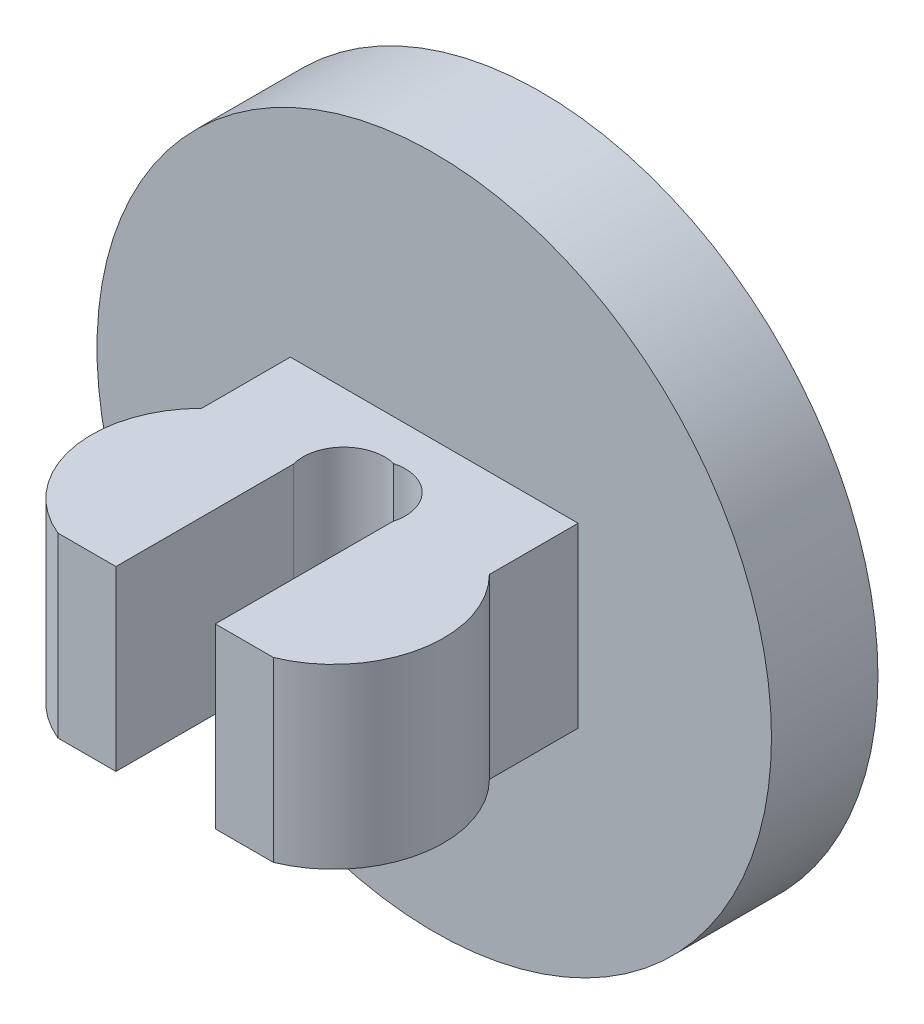
ISO-10303-21;
HEADER;
FILE_DESCRIPTION(('STEP AP214'),'2;1');
FILE_NAME('part.step','',(''),(''),'','','');
FILE_SCHEMA(('AUTOMOTIVE_DESIGN { 1 0 10303 214 1 1 1 1 }'));
ENDSEC;
DATA;
#1=APPLICATION_CONTEXT('core data for automotive mechanical design processes');
#2=APPLICATION_PROTOCOL_DEFINITION('international standard','automotive_design',2000,#1);
#3=PRODUCT_CONTEXT('',#1,'mechanical');
#4=PRODUCT('Part','Part','',(#3));
#5=PRODUCT_RELATED_PRODUCT_CATEGORY('part','',(#4));
#6=PRODUCT_DEFINITION_FORMATION('','',#4);
#7=PRODUCT_DEFINITION_CONTEXT('part definition',#1,'design');
#8=PRODUCT_DEFINITION('design','',#6,#7);
#9=PRODUCT_DEFINITION_SHAPE('','',#8);
#10=(LENGTH_UNIT() NAMED_UNIT(*) SI_UNIT(.MILLI.,.METRE.));
#11=(NAMED_UNIT(*) PLANE_ANGLE_UNIT() SI_UNIT($,.RADIAN.));
#12=(NAMED_UNIT(*) SI_UNIT($,.STERADIAN.) SOLID_ANGLE_UNIT());
#13=UNCERTAINTY_MEASURE_WITH_UNIT(LENGTH_MEASURE(1.E-05),#10,'distance_accuracy_value','');
#14=(GEOMETRIC_REPRESENTATION_CONTEXT(3) GLOBAL_UNCERTAINTY_ASSIGNED_CONTEXT((#13)) GLOBAL_UNIT_ASSIGNED_CONTEXT((#10,
#11,#12)) REPRESENTATION_CONTEXT('',''));
#15=CARTESIAN_POINT('',(0.,0.,0.));
#16=DIRECTION('',(0.,0.,1.));
#17=DIRECTION('',(1.,0.,0.));
#18=AXIS2_PLACEMENT_3D('',#15,#16,#17);
#19=CARTESIAN_POINT('',(0.,0.,3.));
#20=DIRECTION('',(0.,0.,1.));
#21=DIRECTION('',(1.,0.,0.));
#22=AXIS2_PLACEMENT_3D('',#19,#20,#21);
#23=PLANE('',#22);
#24=CARTESIAN_POINT('',(0.,0.,3.));
#25=DIRECTION('',(0.,0.,1.));
#26=DIRECTION('',(1.,0.,0.));
#27=AXIS2_PLACEMENT_3D('',#24,#25,#26);
#28=CIRCLE('',#27,9.5);
#29=CARTESIAN_POINT('',(9.5,0.,3.));
#30=VERTEX_POINT('',#29);
#31=EDGE_CURVE('E11',#30,#30,#28,.T.);
#32=ORIENTED_EDGE('',*,*,#31,.T.);
#33=EDGE_LOOP('',(#32));
#34=FACE_BOUND('',#33,.T.);
#35=DIRECTION('',(0.,-1.,0.));
#36=VECTOR('',#35,1.);
#37=CARTESIAN_POINT('',(4.0530338572275,2.5,3.));
#38=LINE('',#37,#36);
#39=CARTESIAN_POINT('',(4.0530338572275,2.5,3.));
#40=VERTEX_POINT('',#39);
#41=CARTESIAN_POINT('',(4.0530338572275,-2.5,3.));
#42=VERTEX_POINT('',#41);
#43=EDGE_CURVE('E182',#40,#42,#38,.T.);
#44=ORIENTED_EDGE('',*,*,#43,.T.);
#45=DIRECTION('',(-1.,0.,0.));
#46=VECTOR('',#45,1.);
#47=CARTESIAN_POINT('',(-4.0530338572275,-2.5,3.));
#48=LINE('',#47,#46);
#49=CARTESIAN_POINT('',(-4.0530338572275,-2.5,3.));
#50=VERTEX_POINT('',#49);
#51=EDGE_CURVE('E47',#42,#50,#48,.T.);
#52=ORIENTED_EDGE('',*,*,#51,.T.);
#53=DIRECTION('',(0.,-1.,0.));
#54=VECTOR('',#53,1.);
#55=CARTESIAN_POINT('',(-4.0530338572275,2.5,3.));
#56=LINE('',#55,#54);
#57=CARTESIAN_POINT('',(-4.0530338572275,2.5,3.));
#58=VERTEX_POINT('',#57);
#59=EDGE_CURVE('E180',#58,#50,#56,.T.);
#60=ORIENTED_EDGE('',*,*,#59,.F.);
#61=DIRECTION('',(-1.,0.,0.));
#62=VECTOR('',#61,1.);
#63=CARTESIAN_POINT('',(-4.0530338572275,2.5,3.));
#64=LINE('',#63,#62);
#65=EDGE_CURVE('E349',#40,#58,#64,.T.);
#66=ORIENTED_EDGE('',*,*,#65,.F.);
#67=EDGE_LOOP('',(#44,#52,#60,#66));
#68=FACE_BOUND('',#67,.T.);
#69=ADVANCED_FACE('F32',(#34,#68),#23,.T.);
#70=CARTESIAN_POINT('',(0.,0.,3.));
#71=DIRECTION('',(0.,0.,-1.));
#72=DIRECTION('',(-1.,0.,0.));
#73=AXIS2_PLACEMENT_3D('',#70,#71,#72);
#74=CYLINDRICAL_SURFACE('',#73,9.5);
#75=ORIENTED_EDGE('',*,*,#31,.F.);
#76=EDGE_LOOP('',(#75));
#77=FACE_BOUND('',#76,.T.);
#78=CARTESIAN_POINT('',(0.,0.,0.));
#79=DIRECTION('',(0.,0.,1.));
#80=DIRECTION('',(1.,0.,0.));
#81=AXIS2_PLACEMENT_3D('',#78,#79,#80);
#82=CIRCLE('',#81,9.5);
#83=CARTESIAN_POINT('',(9.5,0.,0.));
#84=VERTEX_POINT('',#83);
#85=EDGE_CURVE('E36',#84,#84,#82,.T.);
#86=ORIENTED_EDGE('',*,*,#85,.T.);
#87=EDGE_LOOP('',(#86));
#88=FACE_BOUND('',#87,.T.);
#89=ADVANCED_FACE('F34',(#77,#88),#74,.T.);
#90=CARTESIAN_POINT('',(0.,0.,0.));
#91=DIRECTION('',(0.,0.,1.));
#92=DIRECTION('',(1.,0.,0.));
#93=AXIS2_PLACEMENT_3D('',#90,#91,#92);
#94=PLANE('',#93);
#95=ORIENTED_EDGE('',*,*,#85,.F.);
#96=EDGE_LOOP('',(#95));
#97=FACE_BOUND('',#96,.T.);
#98=ADVANCED_FACE('F200',(#97),#94,.F.);
#99=CARTESIAN_POINT('',(0.28902095810144,2.5,5.25858231023206));
#100=DIRECTION('',(0.,-1.,0.));
#101=DIRECTION('',(0.,0.,-1.));
#102=AXIS2_PLACEMENT_3D('',#99,#100,#101);
#103=CYLINDRICAL_SURFACE('',#102,1.15295111849489);
#104=CARTESIAN_POINT('',(0.28902095810144,-2.5,5.25858231023206));
#105=DIRECTION('',(0.,-1.,0.));
#106=DIRECTION('',(0.,0.,1.));
#107=AXIS2_PLACEMENT_3D('',#104,#105,#106);
#108=CIRCLE('',#107,1.15295111849489);
#109=CARTESIAN_POINT('',(0.,-2.5,4.14244469890596));
#110=VERTEX_POINT('',#109);
#111=CARTESIAN_POINT('',(1.4,-2.5,5.56683845388661));
#112=VERTEX_POINT('',#111);
#113=EDGE_CURVE('E153',#110,#112,#108,.T.);
#114=ORIENTED_EDGE('',*,*,#113,.T.);
#115=DIRECTION('',(0.,-1.,0.));
#116=VECTOR('',#115,1.);
#117=CARTESIAN_POINT('',(1.4,2.5,5.56683845388661));
#118=LINE('',#117,#116);
#119=CARTESIAN_POINT('',(1.4,2.5,5.56683845388661));
#120=VERTEX_POINT('',#119);
#121=EDGE_CURVE('E194',#120,#112,#118,.T.);
#122=ORIENTED_EDGE('',*,*,#121,.F.);
#123=CARTESIAN_POINT('',(0.28902095810144,2.5,5.25858231023206));
#124=DIRECTION('',(0.,-1.,0.));
#125=DIRECTION('',(0.,0.,1.));
#126=AXIS2_PLACEMENT_3D('',#123,#124,#125);
#127=CIRCLE('',#126,1.15295111849489);
#128=CARTESIAN_POINT('',(0.,2.5,4.14244469890596));
#129=VERTEX_POINT('',#128);
#130=EDGE_CURVE('E173',#129,#120,#127,.T.);
#131=ORIENTED_EDGE('',*,*,#130,.F.);
#132=DIRECTION('',(0.,-1.,0.));
#133=VECTOR('',#132,1.);
#134=CARTESIAN_POINT('',(0.,2.5,4.14244469890596));
#135=LINE('',#134,#133);
#136=EDGE_CURVE('E149',#129,#110,#135,.T.);
#137=ORIENTED_EDGE('',*,*,#136,.T.);
#138=EDGE_LOOP('',(#114,#122,#131,#137));
#139=FACE_BOUND('',#138,.T.);
#140=ADVANCED_FACE('F202',(#139),#103,.F.);
#141=CARTESIAN_POINT('',(1.4,2.5,10.5668384538866));
#142=DIRECTION('',(1.,0.,0.));
#143=DIRECTION('',(0.,0.,-1.));
#144=AXIS2_PLACEMENT_3D('',#141,#142,#143);
#145=PLANE('',#144);
#146=DIRECTION('',(0.,0.,1.));
#147=VECTOR('',#146,1.);
#148=CARTESIAN_POINT('',(1.4,-2.5,10.5668384538866));
#149=LINE('',#148,#147);
#150=CARTESIAN_POINT('',(1.4,-2.5,10.5668384538866));
#151=VERTEX_POINT('',#150);
#152=EDGE_CURVE('E156',#112,#151,#149,.T.);
#153=ORIENTED_EDGE('',*,*,#152,.T.);
#154=DIRECTION('',(0.,-1.,0.));
#155=VECTOR('',#154,1.);
#156=CARTESIAN_POINT('',(1.4,2.5,10.5668384538866));
#157=LINE('',#156,#155);
#158=CARTESIAN_POINT('',(1.4,2.5,10.5668384538866));
#159=VERTEX_POINT('',#158);
#160=EDGE_CURVE('E191',#159,#151,#157,.T.);
#161=ORIENTED_EDGE('',*,*,#160,.F.);
#162=DIRECTION('',(0.,0.,1.));
#163=VECTOR('',#162,1.);
#164=CARTESIAN_POINT('',(1.4,2.5,10.5668384538866));
#165=LINE('',#164,#163);
#166=EDGE_CURVE('E103',#120,#159,#165,.T.);
#167=ORIENTED_EDGE('',*,*,#166,.F.);
#168=ORIENTED_EDGE('',*,*,#121,.T.);
#169=EDGE_LOOP('',(#153,#161,#167,#168));
#170=FACE_BOUND('',#169,.T.);
#171=ADVANCED_FACE('F207',(#170),#145,.F.);
#172=CARTESIAN_POINT('',(3.03612301673039,2.5,10.5668384538866));
#173=DIRECTION('',(0.,0.,-1.));
#174=DIRECTION('',(-1.,0.,0.));
#175=AXIS2_PLACEMENT_3D('',#172,#173,#174);
#176=PLANE('',#175);
#177=DIRECTION('',(1.,0.,0.));
#178=VECTOR('',#177,1.);
#179=CARTESIAN_POINT('',(3.03612301673039,-2.5,10.5668384538866));
#180=LINE('',#179,#178);
#181=CARTESIAN_POINT('',(3.03612301673039,-2.5,10.5668384538866));
#182=VERTEX_POINT('',#181);
#183=EDGE_CURVE('E158',#151,#182,#180,.T.);
#184=ORIENTED_EDGE('',*,*,#183,.T.);
#185=DIRECTION('',(0.,-1.,0.));
#186=VECTOR('',#185,1.);
#187=CARTESIAN_POINT('',(3.03612301673039,2.5,10.5668384538866));
#188=LINE('',#187,#186);
#189=CARTESIAN_POINT('',(3.03612301673039,2.5,10.5668384538866));
#190=VERTEX_POINT('',#189);
#191=EDGE_CURVE('E188',#190,#182,#188,.T.);
#192=ORIENTED_EDGE('',*,*,#191,.F.);
#193=DIRECTION('',(1.,0.,0.));
#194=VECTOR('',#193,1.);
#195=CARTESIAN_POINT('',(3.03612301673039,2.5,10.5668384538866));
#196=LINE('',#195,#194);
#197=EDGE_CURVE('E341',#159,#190,#196,.T.);
#198=ORIENTED_EDGE('',*,*,#197,.F.);
#199=ORIENTED_EDGE('',*,*,#160,.T.);
#200=EDGE_LOOP('',(#184,#192,#198,#199));
#201=FACE_BOUND('',#200,.T.);
#202=ADVANCED_FACE('F220',(#201),#176,.F.);
#203=CARTESIAN_POINT('',(1.85369879275646,2.5,7.69406089613511));
#204=DIRECTION('',(0.,-1.,0.));
#205=DIRECTION('',(0.,0.,-1.));
#206=AXIS2_PLACEMENT_3D('',#203,#204,#205);
#207=CYLINDRICAL_SURFACE('',#206,3.10660231470992);
#208=CARTESIAN_POINT('',(1.85369879275646,-2.5,7.69406089613511));
#209=DIRECTION('',(0.,1.,0.));
#210=DIRECTION('',(0.,0.,1.));
#211=AXIS2_PLACEMENT_3D('',#208,#209,#210);
#212=CIRCLE('',#211,3.10660231470992);
#213=CARTESIAN_POINT('',(4.0530338572275,-2.5,5.5));
#214=VERTEX_POINT('',#213);
#215=EDGE_CURVE('E160',#182,#214,#212,.T.);
#216=ORIENTED_EDGE('',*,*,#215,.T.);
#217=DIRECTION('',(0.,-1.,0.));
#218=VECTOR('',#217,1.);
#219=CARTESIAN_POINT('',(4.0530338572275,2.5,5.5));
#220=LINE('',#219,#218);
#221=CARTESIAN_POINT('',(4.0530338572275,2.5,5.5));
#222=VERTEX_POINT('',#221);
#223=EDGE_CURVE('E185',#222,#214,#220,.T.);
#224=ORIENTED_EDGE('',*,*,#223,.F.);
#225=CARTESIAN_POINT('',(1.85369879275646,2.5,7.69406089613511));
#226=DIRECTION('',(0.,1.,0.));
#227=DIRECTION('',(0.,0.,1.));
#228=AXIS2_PLACEMENT_3D('',#225,#226,#227);
#229=CIRCLE('',#228,3.10660231470992);
#230=EDGE_CURVE('E345',#190,#222,#229,.T.);
#231=ORIENTED_EDGE('',*,*,#230,.F.);
#232=ORIENTED_EDGE('',*,*,#191,.T.);
#233=EDGE_LOOP('',(#216,#224,#231,#232));
#234=FACE_BOUND('',#233,.T.);
#235=ADVANCED_FACE('F223',(#234),#207,.T.);
#236=CARTESIAN_POINT('',(4.0530338572275,2.5,5.5));
#237=DIRECTION('',(-1.,0.,0.));
#238=DIRECTION('',(0.,0.,1.));
#239=AXIS2_PLACEMENT_3D('',#236,#237,#238);
#240=PLANE('',#239);
#241=DIRECTION('',(0.,0.,-1.));
#242=VECTOR('',#241,1.);
#243=CARTESIAN_POINT('',(4.0530338572275,-2.5,5.5));
#244=LINE('',#243,#242);
#245=EDGE_CURVE('E162',#214,#42,#244,.T.);
#246=ORIENTED_EDGE('',*,*,#245,.T.);
#247=ORIENTED_EDGE('',*,*,#43,.F.);
#248=DIRECTION('',(0.,0.,-1.));
#249=VECTOR('',#248,1.);
#250=CARTESIAN_POINT('',(4.0530338572275,2.5,5.5));
#251=LINE('',#250,#249);
#252=EDGE_CURVE('E347',#222,#40,#251,.T.);
#253=ORIENTED_EDGE('',*,*,#252,.F.);
#254=ORIENTED_EDGE('',*,*,#223,.T.);
#255=EDGE_LOOP('',(#246,#247,#253,#254));
#256=FACE_BOUND('',#255,.T.);
#257=ADVANCED_FACE('F227',(#256),#240,.F.);
#258=CARTESIAN_POINT('',(-4.0530338572275,2.5,5.5));
#259=DIRECTION('',(1.,0.,0.));
#260=DIRECTION('',(0.,0.,-1.));
#261=AXIS2_PLACEMENT_3D('',#258,#259,#260);
#262=PLANE('',#261);
#263=DIRECTION('',(0.,0.,1.));
#264=VECTOR('',#263,1.);
#265=CARTESIAN_POINT('',(-4.0530338572275,-2.5,5.5));
#266=LINE('',#265,#264);
#267=CARTESIAN_POINT('',(-4.0530338572275,-2.5,5.5));
#268=VERTEX_POINT('',#267);
#269=EDGE_CURVE('E165',#50,#268,#266,.T.);
#270=ORIENTED_EDGE('',*,*,#269,.T.);
#271=DIRECTION('',(0.,-1.,0.));
#272=VECTOR('',#271,1.);
#273=CARTESIAN_POINT('',(-4.0530338572275,2.5,5.5));
#274=LINE('',#273,#272);
#275=CARTESIAN_POINT('',(-4.0530338572275,2.5,5.5));
#276=VERTEX_POINT('',#275);
#277=EDGE_CURVE('E177',#276,#268,#274,.T.);
#278=ORIENTED_EDGE('',*,*,#277,.F.);
#279=DIRECTION('',(0.,0.,1.));
#280=VECTOR('',#279,1.);
#281=CARTESIAN_POINT('',(-4.0530338572275,2.5,5.5));
#282=LINE('',#281,#280);
#283=EDGE_CURVE('E351',#58,#276,#282,.T.);
#284=ORIENTED_EDGE('',*,*,#283,.F.);
#285=ORIENTED_EDGE('',*,*,#59,.T.);
#286=EDGE_LOOP('',(#270,#278,#284,#285));
#287=FACE_BOUND('',#286,.T.);
#288=ADVANCED_FACE('F231',(#287),#262,.F.);
#289=CARTESIAN_POINT('',(-1.85369879275646,2.5,7.69406089613511));
#290=DIRECTION('',(0.,-1.,0.));
#291=DIRECTION('',(0.,0.,-1.));
#292=AXIS2_PLACEMENT_3D('',#289,#290,#291);
#293=CYLINDRICAL_SURFACE('',#292,3.10660231470992);
#294=CARTESIAN_POINT('',(-1.85369879275646,-2.5,7.69406089613511));
#295=DIRECTION('',(0.,1.,0.));
#296=DIRECTION('',(0.,0.,-1.));
#297=AXIS2_PLACEMENT_3D('',#294,#295,#296);
#298=CIRCLE('',#297,3.10660231470992);
#299=CARTESIAN_POINT('',(-3.03612301673039,-2.5,10.5668384538866));
#300=VERTEX_POINT('',#299);
#301=EDGE_CURVE('E167',#268,#300,#298,.T.);
#302=ORIENTED_EDGE('',*,*,#301,.T.);
#303=DIRECTION('',(0.,-1.,0.));
#304=VECTOR('',#303,1.);
#305=CARTESIAN_POINT('',(-3.03612301673039,2.5,10.5668384538866));
#306=LINE('',#305,#304);
#307=CARTESIAN_POINT('',(-3.03612301673039,2.5,10.5668384538866));
#308=VERTEX_POINT('',#307);
#309=EDGE_CURVE('E144',#308,#300,#306,.T.);
#310=ORIENTED_EDGE('',*,*,#309,.F.);
#311=CARTESIAN_POINT('',(-1.85369879275646,2.5,7.69406089613511));
#312=DIRECTION('',(0.,1.,0.));
#313=DIRECTION('',(0.,0.,-1.));
#314=AXIS2_PLACEMENT_3D('',#311,#312,#313);
#315=CIRCLE('',#314,3.10660231470992);
#316=EDGE_CURVE('E132',#276,#308,#315,.T.);
#317=ORIENTED_EDGE('',*,*,#316,.F.);
#318=ORIENTED_EDGE('',*,*,#277,.T.);
#319=EDGE_LOOP('',(#302,#310,#317,#318));
#320=FACE_BOUND('',#319,.T.);
#321=ADVANCED_FACE('F235',(#320),#293,.T.);
#322=CARTESIAN_POINT('',(-3.03612301673039,2.5,10.5668384538866));
#323=DIRECTION('',(0.,0.,-1.));
#324=DIRECTION('',(-1.,0.,0.));
#325=AXIS2_PLACEMENT_3D('',#322,#323,#324);
#326=PLANE('',#325);
#327=DIRECTION('',(1.,0.,0.));
#328=VECTOR('',#327,1.);
#329=CARTESIAN_POINT('',(-3.03612301673039,-2.5,10.5668384538866));
#330=LINE('',#329,#328);
#331=CARTESIAN_POINT('',(-1.4,-2.5,10.5668384538866));
#332=VERTEX_POINT('',#331);
#333=EDGE_CURVE('E141',#300,#332,#330,.T.);
#334=ORIENTED_EDGE('',*,*,#333,.T.);
#335=DIRECTION('',(0.,-1.,0.));
#336=VECTOR('',#335,1.);
#337=CARTESIAN_POINT('',(-1.4,2.5,10.5668384538866));
#338=LINE('',#337,#336);
#339=CARTESIAN_POINT('',(-1.4,2.5,10.5668384538866));
#340=VERTEX_POINT('',#339);
#341=EDGE_CURVE('E138',#340,#332,#338,.T.);
#342=ORIENTED_EDGE('',*,*,#341,.F.);
#343=DIRECTION('',(1.,0.,0.));
#344=VECTOR('',#343,1.);
#345=CARTESIAN_POINT('',(-3.03612301673039,2.5,10.5668384538866));
#346=LINE('',#345,#344);
#347=EDGE_CURVE('E125',#308,#340,#346,.T.);
#348=ORIENTED_EDGE('',*,*,#347,.F.);
#349=ORIENTED_EDGE('',*,*,#309,.T.);
#350=EDGE_LOOP('',(#334,#342,#348,#349));
#351=FACE_BOUND('',#350,.T.);
#352=ADVANCED_FACE('F139',(#351),#326,.F.);
#353=CARTESIAN_POINT('',(-1.4,2.5,10.5668384538866));
#354=DIRECTION('',(-1.,0.,0.));
#355=DIRECTION('',(0.,0.,1.));
#356=AXIS2_PLACEMENT_3D('',#353,#354,#355);
#357=PLANE('',#356);
#358=DIRECTION('',(0.,0.,-1.));
#359=VECTOR('',#358,1.);
#360=CARTESIAN_POINT('',(-1.4,-2.5,10.5668384538866));
#361=LINE('',#360,#359);
#362=CARTESIAN_POINT('',(-1.4,-2.5,5.56683845388661));
#363=VERTEX_POINT('',#362);
#364=EDGE_CURVE('E170',#332,#363,#361,.T.);
#365=ORIENTED_EDGE('',*,*,#364,.T.);
#366=DIRECTION('',(0.,-1.,0.));
#367=VECTOR('',#366,1.);
#368=CARTESIAN_POINT('',(-1.4,2.5,5.56683845388661));
#369=LINE('',#368,#367);
#370=CARTESIAN_POINT('',(-1.4,2.5,5.56683845388661));
#371=VERTEX_POINT('',#370);
#372=EDGE_CURVE('E145',#371,#363,#369,.T.);
#373=ORIENTED_EDGE('',*,*,#372,.F.);
#374=DIRECTION('',(0.,0.,-1.));
#375=VECTOR('',#374,1.);
#376=CARTESIAN_POINT('',(-1.4,2.5,10.5668384538866));
#377=LINE('',#376,#375);
#378=EDGE_CURVE('E129',#340,#371,#377,.T.);
#379=ORIENTED_EDGE('',*,*,#378,.F.);
#380=ORIENTED_EDGE('',*,*,#341,.T.);
#381=EDGE_LOOP('',(#365,#373,#379,#380));
#382=FACE_BOUND('',#381,.T.);
#383=ADVANCED_FACE('F147',(#382),#357,.F.);
#384=CARTESIAN_POINT('',(-0.289020958101439,2.5,5.25858231023206));
#385=DIRECTION('',(0.,-1.,0.));
#386=DIRECTION('',(0.,0.,-1.));
#387=AXIS2_PLACEMENT_3D('',#384,#385,#386);
#388=CYLINDRICAL_SURFACE('',#387,1.15295111849489);
#389=CARTESIAN_POINT('',(-0.289020958101439,-2.5,5.25858231023206));
#390=DIRECTION('',(0.,-1.,0.));
#391=DIRECTION('',(0.,0.,-1.));
#392=AXIS2_PLACEMENT_3D('',#389,#390,#391);
#393=CIRCLE('',#392,1.15295111849489);
#394=EDGE_CURVE('E94',#363,#110,#393,.T.);
#395=ORIENTED_EDGE('',*,*,#394,.T.);
#396=ORIENTED_EDGE('',*,*,#136,.F.);
#397=CARTESIAN_POINT('',(-0.289020958101439,2.5,5.25858231023206));
#398=DIRECTION('',(0.,-1.,0.));
#399=DIRECTION('',(0.,0.,-1.));
#400=AXIS2_PLACEMENT_3D('',#397,#398,#399);
#401=CIRCLE('',#400,1.15295111849489);
#402=EDGE_CURVE('E56',#371,#129,#401,.T.);
#403=ORIENTED_EDGE('',*,*,#402,.F.);
#404=ORIENTED_EDGE('',*,*,#372,.T.);
#405=EDGE_LOOP('',(#395,#396,#403,#404));
#406=FACE_BOUND('',#405,.T.);
#407=ADVANCED_FACE('F244',(#406),#388,.F.);
#408=CARTESIAN_POINT('',(0.28902095810144,2.5,5.25858231023206));
#409=DIRECTION('',(0.,1.,0.));
#410=DIRECTION('',(0.,0.,1.));
#411=AXIS2_PLACEMENT_3D('',#408,#409,#410);
#412=PLANE('',#411);
#413=ORIENTED_EDGE('',*,*,#130,.T.);
#414=ORIENTED_EDGE('',*,*,#166,.T.);
#415=ORIENTED_EDGE('',*,*,#197,.T.);
#416=ORIENTED_EDGE('',*,*,#230,.T.);
#417=ORIENTED_EDGE('',*,*,#252,.T.);
#418=ORIENTED_EDGE('',*,*,#65,.T.);
#419=ORIENTED_EDGE('',*,*,#283,.T.);
#420=ORIENTED_EDGE('',*,*,#316,.T.);
#421=ORIENTED_EDGE('',*,*,#347,.T.);
#422=ORIENTED_EDGE('',*,*,#378,.T.);
#423=ORIENTED_EDGE('',*,*,#402,.T.);
#424=EDGE_LOOP('',(#413,#414,#415,#416,#417,#418,#419,#420,#421,#422,#423));
#425=FACE_BOUND('',#424,.T.);
#426=ADVANCED_FACE('F127',(#425),#412,.T.);
#427=CARTESIAN_POINT('',(0.28902095810144,-2.5,5.25858231023206));
#428=DIRECTION('',(0.,1.,0.));
#429=DIRECTION('',(0.,0.,1.));
#430=AXIS2_PLACEMENT_3D('',#427,#428,#429);
#431=PLANE('',#430);
#432=ORIENTED_EDGE('',*,*,#113,.F.);
#433=ORIENTED_EDGE('',*,*,#394,.F.);
#434=ORIENTED_EDGE('',*,*,#364,.F.);
#435=ORIENTED_EDGE('',*,*,#333,.F.);
#436=ORIENTED_EDGE('',*,*,#301,.F.);
#437=ORIENTED_EDGE('',*,*,#269,.F.);
#438=ORIENTED_EDGE('',*,*,#51,.F.);
#439=ORIENTED_EDGE('',*,*,#245,.F.);
#440=ORIENTED_EDGE('',*,*,#215,.F.);
#441=ORIENTED_EDGE('',*,*,#183,.F.);
#442=ORIENTED_EDGE('',*,*,#152,.F.);
#443=EDGE_LOOP('',(#432,#433,#434,#435,#436,#437,#438,#439,#440,#441,#442));
#444=FACE_BOUND('',#443,.T.);
#445=ADVANCED_FACE('F247',(#444),#431,.F.);
#446=CLOSED_SHELL('',(#69,#89,#98,#140,#171,#202,#235,#257,#288,#321,#352,#383,#407,#426,#445));
#447=MANIFOLD_SOLID_BREP('B2',#446);
#448=ADVANCED_BREP_SHAPE_REPRESENTATION('',(#18,#447),#14);
#449=SHAPE_DEFINITION_REPRESENTATION(#9,#448);
ENDSEC;
END-ISO-10303-21;
